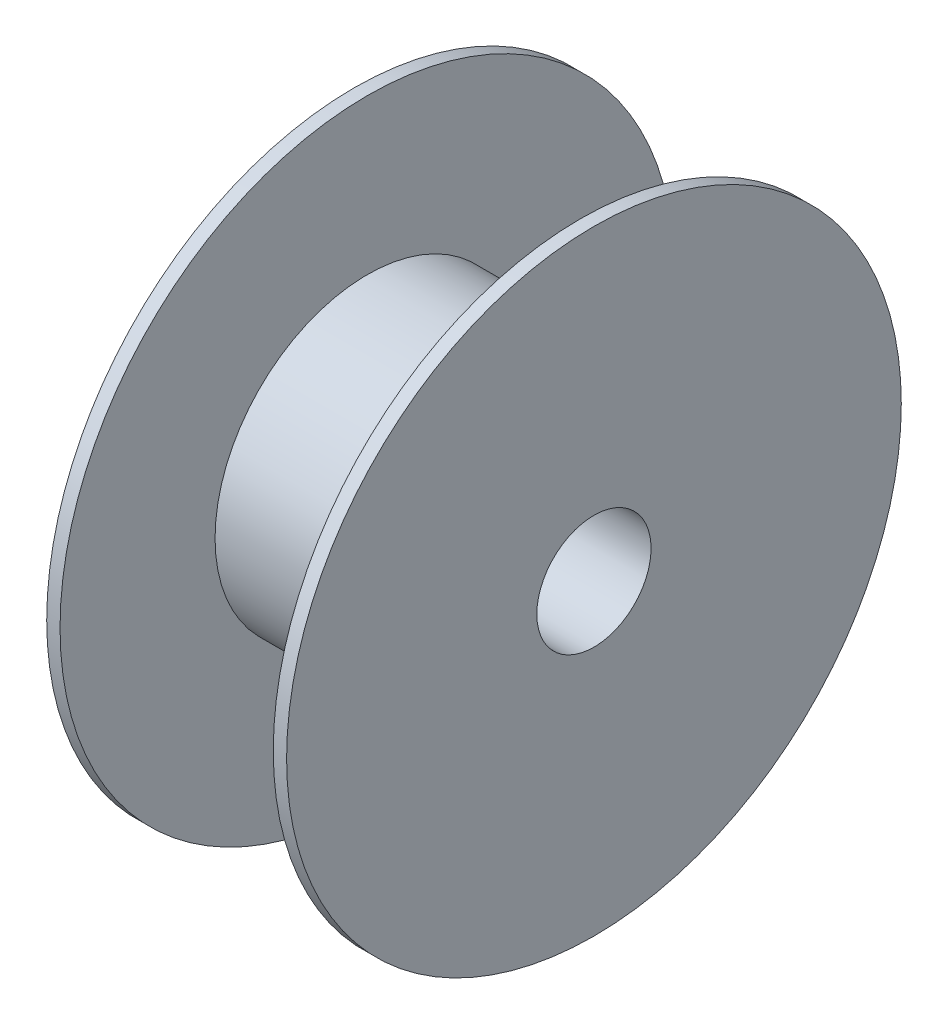
ISO-10303-21;
HEADER;
FILE_DESCRIPTION(('STEP AP214'),'2;1');
FILE_NAME('part.step','',(''),(''),'','','');
FILE_SCHEMA(('AUTOMOTIVE_DESIGN { 1 0 10303 214 1 1 1 1 }'));
ENDSEC;
DATA;
#1=APPLICATION_CONTEXT('core data for automotive mechanical design processes');
#2=APPLICATION_PROTOCOL_DEFINITION('international standard','automotive_design',2000,#1);
#3=PRODUCT_CONTEXT('',#1,'mechanical');
#4=PRODUCT('Part','Part','',(#3));
#5=PRODUCT_RELATED_PRODUCT_CATEGORY('part','',(#4));
#6=PRODUCT_DEFINITION_FORMATION('','',#4);
#7=PRODUCT_DEFINITION_CONTEXT('part definition',#1,'design');
#8=PRODUCT_DEFINITION('design','',#6,#7);
#9=PRODUCT_DEFINITION_SHAPE('','',#8);
#10=(LENGTH_UNIT() NAMED_UNIT(*) SI_UNIT(.MILLI.,.METRE.));
#11=(NAMED_UNIT(*) PLANE_ANGLE_UNIT() SI_UNIT($,.RADIAN.));
#12=(NAMED_UNIT(*) SI_UNIT($,.STERADIAN.) SOLID_ANGLE_UNIT());
#13=UNCERTAINTY_MEASURE_WITH_UNIT(LENGTH_MEASURE(1.E-05),#10,'distance_accuracy_value','');
#14=(GEOMETRIC_REPRESENTATION_CONTEXT(3) GLOBAL_UNCERTAINTY_ASSIGNED_CONTEXT((#13)) GLOBAL_UNIT_ASSIGNED_CONTEXT((#10,
#11,#12)) REPRESENTATION_CONTEXT('',''));
#15=CARTESIAN_POINT('',(0.,0.,0.));
#16=DIRECTION('',(0.,0.,1.));
#17=DIRECTION('',(1.,0.,0.));
#18=AXIS2_PLACEMENT_3D('',#15,#16,#17);
#19=CARTESIAN_POINT('',(80.,102.5,0.));
#20=DIRECTION('',(-1.,0.,0.));
#21=DIRECTION('',(0.,0.,1.));
#22=AXIS2_PLACEMENT_3D('',#19,#20,#21);
#23=PLANE('',#22);
#24=CARTESIAN_POINT('',(80.,0.,0.));
#25=DIRECTION('',(-1.,0.,0.));
#26=DIRECTION('',(0.,0.,1.));
#27=AXIS2_PLACEMENT_3D('',#24,#25,#26);
#28=CIRCLE('',#27,102.5);
#29=CARTESIAN_POINT('',(80.,0.,102.5));
#30=VERTEX_POINT('',#29);
#31=EDGE_CURVE('E59',#30,#30,#28,.T.);
#32=ORIENTED_EDGE('',*,*,#31,.F.);
#33=EDGE_LOOP('',(#32));
#34=FACE_BOUND('',#33,.T.);
#35=CARTESIAN_POINT('',(80.,0.,0.));
#36=DIRECTION('',(-1.,0.,0.));
#37=DIRECTION('',(0.,0.,1.));
#38=AXIS2_PLACEMENT_3D('',#35,#36,#37);
#39=CIRCLE('',#38,19.05);
#40=CARTESIAN_POINT('',(80.,0.,19.05));
#41=VERTEX_POINT('',#40);
#42=EDGE_CURVE('E10',#41,#41,#39,.T.);
#43=ORIENTED_EDGE('',*,*,#42,.T.);
#44=EDGE_LOOP('',(#43));
#45=FACE_BOUND('',#44,.T.);
#46=ADVANCED_FACE('F31',(#34,#45),#23,.F.);
#47=CARTESIAN_POINT('',(0.,0.,0.));
#48=DIRECTION('',(-1.,0.,0.));
#49=DIRECTION('',(0.,0.,1.));
#50=AXIS2_PLACEMENT_3D('',#47,#48,#49);
#51=CYLINDRICAL_SURFACE('',#50,19.05);
#52=ORIENTED_EDGE('',*,*,#42,.F.);
#53=EDGE_LOOP('',(#52));
#54=FACE_BOUND('',#53,.T.);
#55=CARTESIAN_POINT('',(0.,0.,0.));
#56=DIRECTION('',(-1.,0.,0.));
#57=DIRECTION('',(0.,0.,1.));
#58=AXIS2_PLACEMENT_3D('',#55,#56,#57);
#59=CIRCLE('',#58,19.05);
#60=CARTESIAN_POINT('',(0.,0.,19.05));
#61=VERTEX_POINT('',#60);
#62=EDGE_CURVE('E37',#61,#61,#59,.T.);
#63=ORIENTED_EDGE('',*,*,#62,.T.);
#64=EDGE_LOOP('',(#63));
#65=FACE_BOUND('',#64,.T.);
#66=ADVANCED_FACE('F66',(#54,#65),#51,.F.);
#67=CARTESIAN_POINT('',(0.,19.05,0.));
#68=DIRECTION('',(1.,0.,0.));
#69=DIRECTION('',(0.,0.,-1.));
#70=AXIS2_PLACEMENT_3D('',#67,#68,#69);
#71=PLANE('',#70);
#72=ORIENTED_EDGE('',*,*,#62,.F.);
#73=EDGE_LOOP('',(#72));
#74=FACE_BOUND('',#73,.T.);
#75=CARTESIAN_POINT('',(0.,0.,0.));
#76=DIRECTION('',(-1.,0.,0.));
#77=DIRECTION('',(0.,0.,1.));
#78=AXIS2_PLACEMENT_3D('',#75,#76,#77);
#79=CIRCLE('',#78,102.5);
#80=CARTESIAN_POINT('',(0.,0.,102.5));
#81=VERTEX_POINT('',#80);
#82=EDGE_CURVE('E41',#81,#81,#79,.T.);
#83=ORIENTED_EDGE('',*,*,#82,.T.);
#84=EDGE_LOOP('',(#83));
#85=FACE_BOUND('',#84,.T.);
#86=ADVANCED_FACE('F70',(#74,#85),#71,.F.);
#87=CARTESIAN_POINT('',(0.,0.,0.));
#88=DIRECTION('',(-1.,0.,0.));
#89=DIRECTION('',(0.,0.,1.));
#90=AXIS2_PLACEMENT_3D('',#87,#88,#89);
#91=CYLINDRICAL_SURFACE('',#90,102.5);
#92=ORIENTED_EDGE('',*,*,#82,.F.);
#93=EDGE_LOOP('',(#92));
#94=FACE_BOUND('',#93,.T.);
#95=CARTESIAN_POINT('',(4.445,0.,0.));
#96=DIRECTION('',(-1.,0.,0.));
#97=DIRECTION('',(0.,0.,1.));
#98=AXIS2_PLACEMENT_3D('',#95,#96,#97);
#99=CIRCLE('',#98,102.5);
#100=CARTESIAN_POINT('',(4.445,0.,102.5));
#101=VERTEX_POINT('',#100);
#102=EDGE_CURVE('E45',#101,#101,#99,.T.);
#103=ORIENTED_EDGE('',*,*,#102,.T.);
#104=EDGE_LOOP('',(#103));
#105=FACE_BOUND('',#104,.T.);
#106=ADVANCED_FACE('F75',(#94,#105),#91,.T.);
#107=CARTESIAN_POINT('',(4.445,102.5,0.));
#108=DIRECTION('',(-1.,0.,0.));
#109=DIRECTION('',(0.,0.,1.));
#110=AXIS2_PLACEMENT_3D('',#107,#108,#109);
#111=PLANE('',#110);
#112=ORIENTED_EDGE('',*,*,#102,.F.);
#113=EDGE_LOOP('',(#112));
#114=FACE_BOUND('',#113,.T.);
#115=CARTESIAN_POINT('',(4.44500000000001,0.,0.));
#116=DIRECTION('',(-1.,0.,0.));
#117=DIRECTION('',(0.,0.,1.));
#118=AXIS2_PLACEMENT_3D('',#115,#116,#117);
#119=CIRCLE('',#118,50.8);
#120=CARTESIAN_POINT('',(4.44500000000001,0.,50.8));
#121=VERTEX_POINT('',#120);
#122=EDGE_CURVE('E50',#121,#121,#119,.T.);
#123=ORIENTED_EDGE('',*,*,#122,.T.);
#124=EDGE_LOOP('',(#123));
#125=FACE_BOUND('',#124,.T.);
#126=ADVANCED_FACE('F81',(#114,#125),#111,.F.);
#127=CARTESIAN_POINT('',(0.,0.,0.));
#128=DIRECTION('',(-1.,0.,0.));
#129=DIRECTION('',(0.,0.,1.));
#130=AXIS2_PLACEMENT_3D('',#127,#128,#129);
#131=CYLINDRICAL_SURFACE('',#130,50.8);
#132=ORIENTED_EDGE('',*,*,#122,.F.);
#133=EDGE_LOOP('',(#132));
#134=FACE_BOUND('',#133,.T.);
#135=CARTESIAN_POINT('',(75.555,0.,0.));
#136=DIRECTION('',(-1.,0.,0.));
#137=DIRECTION('',(0.,0.,1.));
#138=AXIS2_PLACEMENT_3D('',#135,#136,#137);
#139=CIRCLE('',#138,50.8);
#140=CARTESIAN_POINT('',(75.555,0.,50.8));
#141=VERTEX_POINT('',#140);
#142=EDGE_CURVE('E53',#141,#141,#139,.T.);
#143=ORIENTED_EDGE('',*,*,#142,.T.);
#144=EDGE_LOOP('',(#143));
#145=FACE_BOUND('',#144,.T.);
#146=ADVANCED_FACE('F85',(#134,#145),#131,.T.);
#147=CARTESIAN_POINT('',(75.555,50.8,0.));
#148=DIRECTION('',(1.,0.,0.));
#149=DIRECTION('',(0.,0.,-1.));
#150=AXIS2_PLACEMENT_3D('',#147,#148,#149);
#151=PLANE('',#150);
#152=ORIENTED_EDGE('',*,*,#142,.F.);
#153=EDGE_LOOP('',(#152));
#154=FACE_BOUND('',#153,.T.);
#155=CARTESIAN_POINT('',(75.555,0.,0.));
#156=DIRECTION('',(-1.,0.,0.));
#157=DIRECTION('',(0.,0.,1.));
#158=AXIS2_PLACEMENT_3D('',#155,#156,#157);
#159=CIRCLE('',#158,102.5);
#160=CARTESIAN_POINT('',(75.555,0.,102.5));
#161=VERTEX_POINT('',#160);
#162=EDGE_CURVE('E56',#161,#161,#159,.T.);
#163=ORIENTED_EDGE('',*,*,#162,.T.);
#164=EDGE_LOOP('',(#163));
#165=FACE_BOUND('',#164,.T.);
#166=ADVANCED_FACE('F89',(#154,#165),#151,.F.);
#167=CARTESIAN_POINT('',(0.,0.,0.));
#168=DIRECTION('',(-1.,0.,0.));
#169=DIRECTION('',(0.,0.,1.));
#170=AXIS2_PLACEMENT_3D('',#167,#168,#169);
#171=CYLINDRICAL_SURFACE('',#170,102.5);
#172=ORIENTED_EDGE('',*,*,#162,.F.);
#173=EDGE_LOOP('',(#172));
#174=FACE_BOUND('',#173,.T.);
#175=ORIENTED_EDGE('',*,*,#31,.T.);
#176=EDGE_LOOP('',(#175));
#177=FACE_BOUND('',#176,.T.);
#178=ADVANCED_FACE('F63',(#174,#177),#171,.T.);
#179=CLOSED_SHELL('',(#46,#66,#86,#106,#126,#146,#166,#178));
#180=MANIFOLD_SOLID_BREP('B2',#179);
#181=ADVANCED_BREP_SHAPE_REPRESENTATION('',(#18,#180),#14);
#182=SHAPE_DEFINITION_REPRESENTATION(#9,#181);
ENDSEC;
END-ISO-10303-21;
